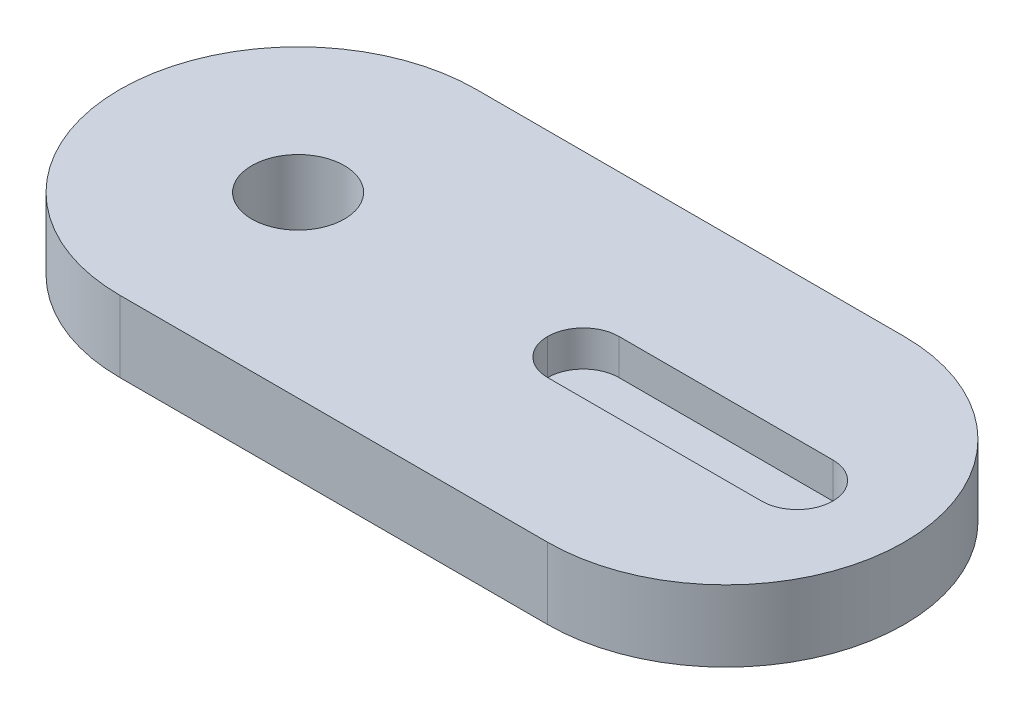
ISO-10303-21;
HEADER;
FILE_DESCRIPTION(('STEP AP214'),'2;1');
FILE_NAME('part.step','',(''),(''),'','','');
FILE_SCHEMA(('AUTOMOTIVE_DESIGN { 1 0 10303 214 1 1 1 1 }'));
ENDSEC;
DATA;
#1=APPLICATION_CONTEXT('core data for automotive mechanical design processes');
#2=APPLICATION_PROTOCOL_DEFINITION('international standard','automotive_design',2000,#1);
#3=PRODUCT_CONTEXT('',#1,'mechanical');
#4=PRODUCT('Part','Part','',(#3));
#5=PRODUCT_RELATED_PRODUCT_CATEGORY('part','',(#4));
#6=PRODUCT_DEFINITION_FORMATION('','',#4);
#7=PRODUCT_DEFINITION_CONTEXT('part definition',#1,'design');
#8=PRODUCT_DEFINITION('design','',#6,#7);
#9=PRODUCT_DEFINITION_SHAPE('','',#8);
#10=(LENGTH_UNIT() NAMED_UNIT(*) SI_UNIT(.MILLI.,.METRE.));
#11=(NAMED_UNIT(*) PLANE_ANGLE_UNIT() SI_UNIT($,.RADIAN.));
#12=(NAMED_UNIT(*) SI_UNIT($,.STERADIAN.) SOLID_ANGLE_UNIT());
#13=UNCERTAINTY_MEASURE_WITH_UNIT(LENGTH_MEASURE(1.E-05),#10,'distance_accuracy_value','');
#14=(GEOMETRIC_REPRESENTATION_CONTEXT(3) GLOBAL_UNCERTAINTY_ASSIGNED_CONTEXT((#13)) GLOBAL_UNIT_ASSIGNED_CONTEXT((#10,
#11,#12)) REPRESENTATION_CONTEXT('',''));
#15=CARTESIAN_POINT('',(0.,0.,0.));
#16=DIRECTION('',(0.,0.,1.));
#17=DIRECTION('',(1.,0.,0.));
#18=AXIS2_PLACEMENT_3D('',#15,#16,#17);
#19=CARTESIAN_POINT('',(0.,2.54,0.));
#20=DIRECTION('',(0.,-1.,0.));
#21=DIRECTION('',(0.,0.,-1.));
#22=AXIS2_PLACEMENT_3D('',#19,#20,#21);
#23=CYLINDRICAL_SURFACE('',#22,6.35);
#24=CARTESIAN_POINT('',(0.,0.,0.));
#25=DIRECTION('',(0.,1.,0.));
#26=DIRECTION('',(0.,0.,1.));
#27=AXIS2_PLACEMENT_3D('',#24,#25,#26);
#28=CIRCLE('',#27,6.35);
#29=CARTESIAN_POINT('',(0.,0.,-6.35));
#30=VERTEX_POINT('',#29);
#31=CARTESIAN_POINT('',(0.,0.,6.35));
#32=VERTEX_POINT('',#31);
#33=EDGE_CURVE('E148',#30,#32,#28,.T.);
#34=ORIENTED_EDGE('',*,*,#33,.T.);
#35=DIRECTION('',(0.,-1.,0.));
#36=VECTOR('',#35,1.);
#37=CARTESIAN_POINT('',(0.,2.54,6.35));
#38=LINE('',#37,#36);
#39=CARTESIAN_POINT('',(0.,2.54,6.35));
#40=VERTEX_POINT('',#39);
#41=EDGE_CURVE('E127',#40,#32,#38,.T.);
#42=ORIENTED_EDGE('',*,*,#41,.F.);
#43=CARTESIAN_POINT('',(0.,2.54,0.));
#44=DIRECTION('',(0.,1.,0.));
#45=DIRECTION('',(0.,0.,1.));
#46=AXIS2_PLACEMENT_3D('',#43,#44,#45);
#47=CIRCLE('',#46,6.35);
#48=CARTESIAN_POINT('',(0.,2.54,-6.35));
#49=VERTEX_POINT('',#48);
#50=EDGE_CURVE('E135',#49,#40,#47,.T.);
#51=ORIENTED_EDGE('',*,*,#50,.F.);
#52=DIRECTION('',(0.,-1.,0.));
#53=VECTOR('',#52,1.);
#54=CARTESIAN_POINT('',(0.,2.54,-6.35));
#55=LINE('',#54,#53);
#56=EDGE_CURVE('E236',#49,#30,#55,.T.);
#57=ORIENTED_EDGE('',*,*,#56,.T.);
#58=EDGE_LOOP('',(#34,#42,#51,#57));
#59=FACE_BOUND('',#58,.T.);
#60=ADVANCED_FACE('F45',(#59),#23,.T.);
#61=CARTESIAN_POINT('',(0.,2.54,6.35));
#62=DIRECTION('',(0.,0.,-1.));
#63=DIRECTION('',(-1.,0.,0.));
#64=AXIS2_PLACEMENT_3D('',#61,#62,#63);
#65=PLANE('',#64);
#66=DIRECTION('',(1.,0.,0.));
#67=VECTOR('',#66,1.);
#68=CARTESIAN_POINT('',(0.,0.,6.35));
#69=LINE('',#68,#67);
#70=CARTESIAN_POINT('',(15.24,0.,6.35));
#71=VERTEX_POINT('',#70);
#72=EDGE_CURVE('E239',#32,#71,#69,.T.);
#73=ORIENTED_EDGE('',*,*,#72,.T.);
#74=DIRECTION('',(0.,-1.,0.));
#75=VECTOR('',#74,1.);
#76=CARTESIAN_POINT('',(15.24,2.54,6.35));
#77=LINE('',#76,#75);
#78=CARTESIAN_POINT('',(15.24,2.54,6.35));
#79=VERTEX_POINT('',#78);
#80=EDGE_CURVE('E130',#79,#71,#77,.T.);
#81=ORIENTED_EDGE('',*,*,#80,.F.);
#82=DIRECTION('',(1.,0.,0.));
#83=VECTOR('',#82,1.);
#84=CARTESIAN_POINT('',(0.,2.54,6.35));
#85=LINE('',#84,#83);
#86=EDGE_CURVE('E123',#40,#79,#85,.T.);
#87=ORIENTED_EDGE('',*,*,#86,.F.);
#88=ORIENTED_EDGE('',*,*,#41,.T.);
#89=EDGE_LOOP('',(#73,#81,#87,#88));
#90=FACE_BOUND('',#89,.T.);
#91=ADVANCED_FACE('F125',(#90),#65,.F.);
#92=CARTESIAN_POINT('',(15.24,2.54,0.));
#93=DIRECTION('',(0.,-1.,0.));
#94=DIRECTION('',(0.,0.,-1.));
#95=AXIS2_PLACEMENT_3D('',#92,#93,#94);
#96=CYLINDRICAL_SURFACE('',#95,6.35);
#97=CARTESIAN_POINT('',(15.24,0.,0.));
#98=DIRECTION('',(0.,1.,0.));
#99=DIRECTION('',(0.,0.,1.));
#100=AXIS2_PLACEMENT_3D('',#97,#98,#99);
#101=CIRCLE('',#100,6.35);
#102=CARTESIAN_POINT('',(15.24,0.,-6.35));
#103=VERTEX_POINT('',#102);
#104=EDGE_CURVE('E242',#71,#103,#101,.T.);
#105=ORIENTED_EDGE('',*,*,#104,.T.);
#106=DIRECTION('',(0.,-1.,0.));
#107=VECTOR('',#106,1.);
#108=CARTESIAN_POINT('',(15.24,2.54,-6.35));
#109=LINE('',#108,#107);
#110=CARTESIAN_POINT('',(15.24,2.54,-6.35));
#111=VERTEX_POINT('',#110);
#112=EDGE_CURVE('E157',#111,#103,#109,.T.);
#113=ORIENTED_EDGE('',*,*,#112,.F.);
#114=CARTESIAN_POINT('',(15.24,2.54,0.));
#115=DIRECTION('',(0.,1.,0.));
#116=DIRECTION('',(0.,0.,1.));
#117=AXIS2_PLACEMENT_3D('',#114,#115,#116);
#118=CIRCLE('',#117,6.35);
#119=EDGE_CURVE('E134',#79,#111,#118,.T.);
#120=ORIENTED_EDGE('',*,*,#119,.F.);
#121=ORIENTED_EDGE('',*,*,#80,.T.);
#122=EDGE_LOOP('',(#105,#113,#120,#121));
#123=FACE_BOUND('',#122,.T.);
#124=ADVANCED_FACE('F258',(#123),#96,.T.);
#125=CARTESIAN_POINT('',(0.,2.54,-6.35));
#126=DIRECTION('',(0.,0.,1.));
#127=DIRECTION('',(1.,0.,0.));
#128=AXIS2_PLACEMENT_3D('',#125,#126,#127);
#129=PLANE('',#128);
#130=DIRECTION('',(-1.,0.,0.));
#131=VECTOR('',#130,1.);
#132=CARTESIAN_POINT('',(0.,0.,-6.35));
#133=LINE('',#132,#131);
#134=EDGE_CURVE('E145',#103,#30,#133,.T.);
#135=ORIENTED_EDGE('',*,*,#134,.T.);
#136=ORIENTED_EDGE('',*,*,#56,.F.);
#137=DIRECTION('',(-1.,0.,0.));
#138=VECTOR('',#137,1.);
#139=CARTESIAN_POINT('',(0.,2.54,-6.35));
#140=LINE('',#139,#138);
#141=EDGE_CURVE('E140',#111,#49,#140,.T.);
#142=ORIENTED_EDGE('',*,*,#141,.F.);
#143=ORIENTED_EDGE('',*,*,#112,.T.);
#144=EDGE_LOOP('',(#135,#136,#142,#143));
#145=FACE_BOUND('',#144,.T.);
#146=ADVANCED_FACE('F253',(#145),#129,.F.);
#147=CARTESIAN_POINT('',(0.,2.54,0.));
#148=DIRECTION('',(0.,1.,0.));
#149=DIRECTION('',(0.,0.,1.));
#150=AXIS2_PLACEMENT_3D('',#147,#148,#149);
#151=PLANE('',#150);
#152=CARTESIAN_POINT('',(10.16,2.54,0.));
#153=DIRECTION('',(0.,1.,0.));
#154=DIRECTION('',(0.,0.,1.));
#155=AXIS2_PLACEMENT_3D('',#152,#153,#154);
#156=CIRCLE('',#155,1.27);
#157=CARTESIAN_POINT('',(10.16,2.54,1.27));
#158=VERTEX_POINT('',#157);
#159=CARTESIAN_POINT('',(8.89,2.54,0.));
#160=VERTEX_POINT('',#159);
#161=EDGE_CURVE('E55',#158,#160,#156,.F.);
#162=ORIENTED_EDGE('',*,*,#161,.T.);
#163=CARTESIAN_POINT('',(10.16,2.54,0.));
#164=DIRECTION('',(0.,1.,0.));
#165=DIRECTION('',(0.,0.,1.));
#166=AXIS2_PLACEMENT_3D('',#163,#164,#165);
#167=CIRCLE('',#166,1.27);
#168=CARTESIAN_POINT('',(10.16,2.54,-1.27));
#169=VERTEX_POINT('',#168);
#170=EDGE_CURVE('E11',#160,#169,#167,.F.);
#171=ORIENTED_EDGE('',*,*,#170,.T.);
#172=DIRECTION('',(-1.,0.,0.));
#173=VECTOR('',#172,1.);
#174=CARTESIAN_POINT('',(8.89,2.54,-1.27));
#175=LINE('',#174,#173);
#176=CARTESIAN_POINT('',(17.78,2.54,-1.27));
#177=VERTEX_POINT('',#176);
#178=EDGE_CURVE('E197',#177,#169,#175,.T.);
#179=ORIENTED_EDGE('',*,*,#178,.F.);
#180=CARTESIAN_POINT('',(17.78,2.54,0.));
#181=DIRECTION('',(0.,1.,0.));
#182=DIRECTION('',(0.,0.,1.));
#183=AXIS2_PLACEMENT_3D('',#180,#181,#182);
#184=CIRCLE('',#183,1.27);
#185=CARTESIAN_POINT('',(19.05,2.54,0.));
#186=VERTEX_POINT('',#185);
#187=EDGE_CURVE('E68',#177,#186,#184,.F.);
#188=ORIENTED_EDGE('',*,*,#187,.T.);
#189=CARTESIAN_POINT('',(17.78,2.54,0.));
#190=DIRECTION('',(0.,1.,0.));
#191=DIRECTION('',(0.,0.,1.));
#192=AXIS2_PLACEMENT_3D('',#189,#190,#191);
#193=CIRCLE('',#192,1.27);
#194=CARTESIAN_POINT('',(17.78,2.54,1.27));
#195=VERTEX_POINT('',#194);
#196=EDGE_CURVE('E182',#186,#195,#193,.F.);
#197=ORIENTED_EDGE('',*,*,#196,.T.);
#198=DIRECTION('',(1.,0.,0.));
#199=VECTOR('',#198,1.);
#200=CARTESIAN_POINT('',(8.89,2.54,1.27));
#201=LINE('',#200,#199);
#202=EDGE_CURVE('E191',#158,#195,#201,.T.);
#203=ORIENTED_EDGE('',*,*,#202,.F.);
#204=EDGE_LOOP('',(#162,#171,#179,#188,#197,#203));
#205=FACE_BOUND('',#204,.T.);
#206=CARTESIAN_POINT('',(0.,2.54,0.));
#207=DIRECTION('',(0.,1.,0.));
#208=DIRECTION('',(0.,0.,1.));
#209=AXIS2_PLACEMENT_3D('',#206,#207,#208);
#210=CIRCLE('',#209,1.651);
#211=CARTESIAN_POINT('',(0.,2.54,1.651));
#212=VERTEX_POINT('',#211);
#213=EDGE_CURVE('E228',#212,#212,#210,.T.);
#214=ORIENTED_EDGE('',*,*,#213,.F.);
#215=EDGE_LOOP('',(#214));
#216=FACE_BOUND('',#215,.T.);
#217=ORIENTED_EDGE('',*,*,#50,.T.);
#218=ORIENTED_EDGE('',*,*,#86,.T.);
#219=ORIENTED_EDGE('',*,*,#119,.T.);
#220=ORIENTED_EDGE('',*,*,#141,.T.);
#221=EDGE_LOOP('',(#217,#218,#219,#220));
#222=FACE_BOUND('',#221,.T.);
#223=ADVANCED_FACE('F138',(#205,#216,#222),#151,.T.);
#224=CARTESIAN_POINT('',(0.,0.,0.));
#225=DIRECTION('',(0.,1.,0.));
#226=DIRECTION('',(0.,0.,1.));
#227=AXIS2_PLACEMENT_3D('',#224,#225,#226);
#228=PLANE('',#227);
#229=CARTESIAN_POINT('',(0.,0.,0.));
#230=DIRECTION('',(0.,1.,0.));
#231=DIRECTION('',(0.,0.,1.));
#232=AXIS2_PLACEMENT_3D('',#229,#230,#231);
#233=CIRCLE('',#232,1.651);
#234=CARTESIAN_POINT('',(0.,0.,1.651));
#235=VERTEX_POINT('',#234);
#236=EDGE_CURVE('E224',#235,#235,#233,.T.);
#237=ORIENTED_EDGE('',*,*,#236,.T.);
#238=EDGE_LOOP('',(#237));
#239=FACE_BOUND('',#238,.T.);
#240=ORIENTED_EDGE('',*,*,#33,.F.);
#241=ORIENTED_EDGE('',*,*,#134,.F.);
#242=ORIENTED_EDGE('',*,*,#104,.F.);
#243=ORIENTED_EDGE('',*,*,#72,.F.);
#244=EDGE_LOOP('',(#240,#241,#242,#243));
#245=FACE_BOUND('',#244,.T.);
#246=ADVANCED_FACE('F257',(#239,#245),#228,.F.);
#247=CARTESIAN_POINT('',(0.,0.,0.));
#248=DIRECTION('',(0.,1.,0.));
#249=DIRECTION('',(0.,0.,1.));
#250=AXIS2_PLACEMENT_3D('',#247,#248,#249);
#251=CYLINDRICAL_SURFACE('',#250,1.651);
#252=ORIENTED_EDGE('',*,*,#236,.F.);
#253=EDGE_LOOP('',(#252));
#254=FACE_BOUND('',#253,.T.);
#255=ORIENTED_EDGE('',*,*,#213,.T.);
#256=EDGE_LOOP('',(#255));
#257=FACE_BOUND('',#256,.T.);
#258=ADVANCED_FACE('F319',(#254,#257),#251,.F.);
#259=CARTESIAN_POINT('',(8.89,1.27,-1.27));
#260=DIRECTION('',(0.,0.,-1.));
#261=DIRECTION('',(-1.,0.,0.));
#262=AXIS2_PLACEMENT_3D('',#259,#260,#261);
#263=PLANE('',#262);
#264=DIRECTION('',(-1.,0.,0.));
#265=VECTOR('',#264,1.);
#266=CARTESIAN_POINT('',(8.89,1.27,-1.27));
#267=LINE('',#266,#265);
#268=CARTESIAN_POINT('',(17.78,1.27,-1.27));
#269=VERTEX_POINT('',#268);
#270=CARTESIAN_POINT('',(10.16,1.27,-1.27));
#271=VERTEX_POINT('',#270);
#272=EDGE_CURVE('E220',#269,#271,#267,.T.);
#273=ORIENTED_EDGE('',*,*,#272,.F.);
#274=DIRECTION('',(0.,1.,0.));
#275=VECTOR('',#274,1.);
#276=CARTESIAN_POINT('',(17.78,2.54,-1.27));
#277=LINE('',#276,#275);
#278=EDGE_CURVE('E179',#269,#177,#277,.T.);
#279=ORIENTED_EDGE('',*,*,#278,.T.);
#280=ORIENTED_EDGE('',*,*,#178,.T.);
#281=DIRECTION('',(0.,1.,0.));
#282=VECTOR('',#281,1.);
#283=CARTESIAN_POINT('',(10.16,1.27,-1.27));
#284=LINE('',#283,#282);
#285=EDGE_CURVE('E176',#169,#271,#284,.F.);
#286=ORIENTED_EDGE('',*,*,#285,.T.);
#287=EDGE_LOOP('',(#273,#279,#280,#286));
#288=FACE_BOUND('',#287,.T.);
#289=ADVANCED_FACE('F212',(#288),#263,.F.);
#290=CARTESIAN_POINT('',(8.89,1.27,1.27));
#291=DIRECTION('',(0.,0.,1.));
#292=DIRECTION('',(1.,0.,0.));
#293=AXIS2_PLACEMENT_3D('',#290,#291,#292);
#294=PLANE('',#293);
#295=ORIENTED_EDGE('',*,*,#202,.T.);
#296=DIRECTION('',(0.,1.,0.));
#297=VECTOR('',#296,1.);
#298=CARTESIAN_POINT('',(17.78,1.27,1.27));
#299=LINE('',#298,#297);
#300=CARTESIAN_POINT('',(17.78,1.27,1.27));
#301=VERTEX_POINT('',#300);
#302=EDGE_CURVE('E155',#195,#301,#299,.F.);
#303=ORIENTED_EDGE('',*,*,#302,.T.);
#304=DIRECTION('',(1.,0.,0.));
#305=VECTOR('',#304,1.);
#306=CARTESIAN_POINT('',(8.89,1.27,1.27));
#307=LINE('',#306,#305);
#308=CARTESIAN_POINT('',(10.16,1.27,1.27));
#309=VERTEX_POINT('',#308);
#310=EDGE_CURVE('E216',#309,#301,#307,.T.);
#311=ORIENTED_EDGE('',*,*,#310,.F.);
#312=DIRECTION('',(0.,1.,0.));
#313=VECTOR('',#312,1.);
#314=CARTESIAN_POINT('',(10.16,2.54,1.27));
#315=LINE('',#314,#313);
#316=EDGE_CURVE('E150',#309,#158,#315,.T.);
#317=ORIENTED_EDGE('',*,*,#316,.T.);
#318=EDGE_LOOP('',(#295,#303,#311,#317));
#319=FACE_BOUND('',#318,.T.);
#320=ADVANCED_FACE('F302',(#319),#294,.F.);
#321=CARTESIAN_POINT('',(0.,1.27,0.));
#322=DIRECTION('',(0.,1.,0.));
#323=DIRECTION('',(0.,0.,1.));
#324=AXIS2_PLACEMENT_3D('',#321,#322,#323);
#325=PLANE('',#324);
#326=ORIENTED_EDGE('',*,*,#310,.T.);
#327=CARTESIAN_POINT('',(17.78,1.27,0.));
#328=DIRECTION('',(0.,1.,0.));
#329=DIRECTION('',(0.,0.,1.));
#330=AXIS2_PLACEMENT_3D('',#327,#328,#329);
#331=CIRCLE('',#330,1.27);
#332=CARTESIAN_POINT('',(19.05,1.27,0.));
#333=VERTEX_POINT('',#332);
#334=EDGE_CURVE('E173',#301,#333,#331,.T.);
#335=ORIENTED_EDGE('',*,*,#334,.T.);
#336=CARTESIAN_POINT('',(17.78,1.27,0.));
#337=DIRECTION('',(0.,1.,0.));
#338=DIRECTION('',(0.,0.,1.));
#339=AXIS2_PLACEMENT_3D('',#336,#337,#338);
#340=CIRCLE('',#339,1.27);
#341=EDGE_CURVE('E170',#333,#269,#340,.T.);
#342=ORIENTED_EDGE('',*,*,#341,.T.);
#343=ORIENTED_EDGE('',*,*,#272,.T.);
#344=CARTESIAN_POINT('',(10.16,1.27,0.));
#345=DIRECTION('',(0.,1.,0.));
#346=DIRECTION('',(0.,0.,1.));
#347=AXIS2_PLACEMENT_3D('',#344,#345,#346);
#348=CIRCLE('',#347,1.27);
#349=CARTESIAN_POINT('',(8.89,1.27,0.));
#350=VERTEX_POINT('',#349);
#351=EDGE_CURVE('E164',#271,#350,#348,.T.);
#352=ORIENTED_EDGE('',*,*,#351,.T.);
#353=CARTESIAN_POINT('',(10.16,1.27,0.));
#354=DIRECTION('',(0.,1.,0.));
#355=DIRECTION('',(0.,0.,1.));
#356=AXIS2_PLACEMENT_3D('',#353,#354,#355);
#357=CIRCLE('',#356,1.27);
#358=EDGE_CURVE('E167',#350,#309,#357,.T.);
#359=ORIENTED_EDGE('',*,*,#358,.T.);
#360=EDGE_LOOP('',(#326,#335,#342,#343,#352,#359));
#361=FACE_BOUND('',#360,.T.);
#362=ADVANCED_FACE('F277',(#361),#325,.T.);
#363=CARTESIAN_POINT('',(17.78,1.27,0.));
#364=DIRECTION('',(0.,-1.,0.));
#365=DIRECTION('',(0.,0.,-1.));
#366=AXIS2_PLACEMENT_3D('',#363,#364,#365);
#367=CYLINDRICAL_SURFACE('',#366,1.27);
#368=ORIENTED_EDGE('',*,*,#278,.F.);
#369=ORIENTED_EDGE('',*,*,#341,.F.);
#370=DIRECTION('',(0.,1.,0.));
#371=VECTOR('',#370,1.);
#372=CARTESIAN_POINT('',(19.05,1.27,0.));
#373=LINE('',#372,#371);
#374=EDGE_CURVE('E188',#186,#333,#373,.F.);
#375=ORIENTED_EDGE('',*,*,#374,.F.);
#376=ORIENTED_EDGE('',*,*,#187,.F.);
#377=EDGE_LOOP('',(#368,#369,#375,#376));
#378=FACE_BOUND('',#377,.T.);
#379=ADVANCED_FACE('F275',(#378),#367,.F.);
#380=CARTESIAN_POINT('',(17.78,1.27,0.));
#381=DIRECTION('',(0.,-1.,0.));
#382=DIRECTION('',(0.,0.,-1.));
#383=AXIS2_PLACEMENT_3D('',#380,#381,#382);
#384=CYLINDRICAL_SURFACE('',#383,1.27);
#385=ORIENTED_EDGE('',*,*,#334,.F.);
#386=ORIENTED_EDGE('',*,*,#302,.F.);
#387=ORIENTED_EDGE('',*,*,#196,.F.);
#388=ORIENTED_EDGE('',*,*,#374,.T.);
#389=EDGE_LOOP('',(#385,#386,#387,#388));
#390=FACE_BOUND('',#389,.T.);
#391=ADVANCED_FACE('F272',(#390),#384,.F.);
#392=CARTESIAN_POINT('',(10.16,1.27,0.));
#393=DIRECTION('',(0.,-1.,0.));
#394=DIRECTION('',(0.,0.,-1.));
#395=AXIS2_PLACEMENT_3D('',#392,#393,#394);
#396=CYLINDRICAL_SURFACE('',#395,1.27);
#397=DIRECTION('',(0.,1.,0.));
#398=VECTOR('',#397,1.);
#399=CARTESIAN_POINT('',(8.89,2.54,0.));
#400=LINE('',#399,#398);
#401=EDGE_CURVE('E49',#350,#160,#400,.T.);
#402=ORIENTED_EDGE('',*,*,#401,.F.);
#403=ORIENTED_EDGE('',*,*,#351,.F.);
#404=ORIENTED_EDGE('',*,*,#285,.F.);
#405=ORIENTED_EDGE('',*,*,#170,.F.);
#406=EDGE_LOOP('',(#402,#403,#404,#405));
#407=FACE_BOUND('',#406,.T.);
#408=ADVANCED_FACE('F47',(#407),#396,.F.);
#409=CARTESIAN_POINT('',(10.16,1.27,0.));
#410=DIRECTION('',(0.,-1.,0.));
#411=DIRECTION('',(0.,0.,-1.));
#412=AXIS2_PLACEMENT_3D('',#409,#410,#411);
#413=CYLINDRICAL_SURFACE('',#412,1.27);
#414=ORIENTED_EDGE('',*,*,#358,.F.);
#415=ORIENTED_EDGE('',*,*,#401,.T.);
#416=ORIENTED_EDGE('',*,*,#161,.F.);
#417=ORIENTED_EDGE('',*,*,#316,.F.);
#418=EDGE_LOOP('',(#414,#415,#416,#417));
#419=FACE_BOUND('',#418,.T.);
#420=ADVANCED_FACE('F203',(#419),#413,.F.);
#421=CLOSED_SHELL('',(#60,#91,#124,#146,#223,#246,#258,#289,#320,#362,#379,#391,#408,#420));
#422=MANIFOLD_SOLID_BREP('B2',#421);
#423=ADVANCED_BREP_SHAPE_REPRESENTATION('',(#18,#422),#14);
#424=SHAPE_DEFINITION_REPRESENTATION(#9,#423);
ENDSEC;
END-ISO-10303-21;
